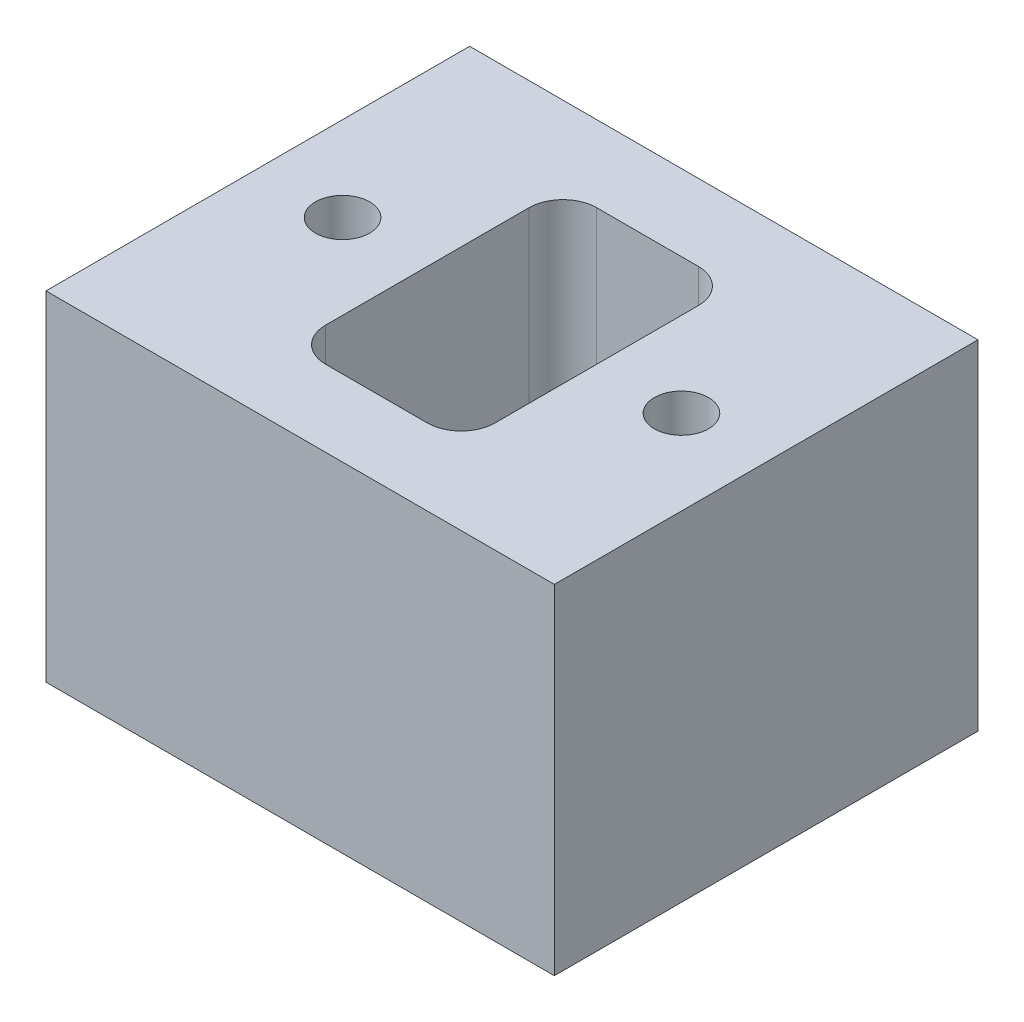
ISO-10303-21;
HEADER;
FILE_DESCRIPTION(('STEP AP214'),'2;1');
FILE_NAME('part.step','',(''),(''),'','','');
FILE_SCHEMA(('AUTOMOTIVE_DESIGN { 1 0 10303 214 1 1 1 1 }'));
ENDSEC;
DATA;
#1=APPLICATION_CONTEXT('core data for automotive mechanical design processes');
#2=APPLICATION_PROTOCOL_DEFINITION('international standard','automotive_design',2000,#1);
#3=PRODUCT_CONTEXT('',#1,'mechanical');
#4=PRODUCT('Part','Part','',(#3));
#5=PRODUCT_RELATED_PRODUCT_CATEGORY('part','',(#4));
#6=PRODUCT_DEFINITION_FORMATION('','',#4);
#7=PRODUCT_DEFINITION_CONTEXT('part definition',#1,'design');
#8=PRODUCT_DEFINITION('design','',#6,#7);
#9=PRODUCT_DEFINITION_SHAPE('','',#8);
#10=(LENGTH_UNIT() NAMED_UNIT(*) SI_UNIT(.MILLI.,.METRE.));
#11=(NAMED_UNIT(*) PLANE_ANGLE_UNIT() SI_UNIT($,.RADIAN.));
#12=(NAMED_UNIT(*) SI_UNIT($,.STERADIAN.) SOLID_ANGLE_UNIT());
#13=UNCERTAINTY_MEASURE_WITH_UNIT(LENGTH_MEASURE(1.E-05),#10,'distance_accuracy_value','');
#14=(GEOMETRIC_REPRESENTATION_CONTEXT(3) GLOBAL_UNCERTAINTY_ASSIGNED_CONTEXT((#13)) GLOBAL_UNIT_ASSIGNED_CONTEXT((#10,
#11,#12)) REPRESENTATION_CONTEXT('',''));
#15=CARTESIAN_POINT('',(0.,0.,0.));
#16=DIRECTION('',(0.,0.,1.));
#17=DIRECTION('',(1.,0.,0.));
#18=AXIS2_PLACEMENT_3D('',#15,#16,#17);
#19=CARTESIAN_POINT('',(0.,20.,0.));
#20=DIRECTION('',(0.,-1.,0.));
#21=DIRECTION('',(0.,0.,-1.));
#22=AXIS2_PLACEMENT_3D('',#19,#20,#21);
#23=PLANE('',#22);
#24=DIRECTION('',(1.,0.,0.));
#25=VECTOR('',#24,1.);
#26=CARTESIAN_POINT('',(-3.,20.,8.));
#27=LINE('',#26,#25);
#28=CARTESIAN_POINT('',(-3.,20.,8.));
#29=VERTEX_POINT('',#28);
#30=CARTESIAN_POINT('',(3.,20.,8.));
#31=VERTEX_POINT('',#30);
#32=EDGE_CURVE('E163',#29,#31,#27,.T.);
#33=ORIENTED_EDGE('',*,*,#32,.F.);
#34=CARTESIAN_POINT('',(-3.,20.,6.));
#35=DIRECTION('',(0.,1.,0.));
#36=DIRECTION('',(0.,0.,-1.));
#37=AXIS2_PLACEMENT_3D('',#34,#35,#36);
#38=CIRCLE('',#37,2.);
#39=CARTESIAN_POINT('',(-5.,20.,6.));
#40=VERTEX_POINT('',#39);
#41=EDGE_CURVE('E50',#40,#29,#38,.T.);
#42=ORIENTED_EDGE('',*,*,#41,.F.);
#43=DIRECTION('',(0.,0.,1.));
#44=VECTOR('',#43,1.);
#45=CARTESIAN_POINT('',(-5.,20.,6.));
#46=LINE('',#45,#44);
#47=CARTESIAN_POINT('',(-5.,20.,-6.));
#48=VERTEX_POINT('',#47);
#49=EDGE_CURVE('E143',#48,#40,#46,.T.);
#50=ORIENTED_EDGE('',*,*,#49,.F.);
#51=CARTESIAN_POINT('',(-3.,20.,-6.));
#52=DIRECTION('',(0.,1.,0.));
#53=DIRECTION('',(0.,0.,-1.));
#54=AXIS2_PLACEMENT_3D('',#51,#52,#53);
#55=CIRCLE('',#54,2.);
#56=CARTESIAN_POINT('',(-3.,20.,-8.));
#57=VERTEX_POINT('',#56);
#58=EDGE_CURVE('E146',#57,#48,#55,.T.);
#59=ORIENTED_EDGE('',*,*,#58,.F.);
#60=DIRECTION('',(-1.,0.,0.));
#61=VECTOR('',#60,1.);
#62=CARTESIAN_POINT('',(-3.,20.,-8.));
#63=LINE('',#62,#61);
#64=CARTESIAN_POINT('',(3.,20.,-8.));
#65=VERTEX_POINT('',#64);
#66=EDGE_CURVE('E174',#65,#57,#63,.T.);
#67=ORIENTED_EDGE('',*,*,#66,.F.);
#68=CARTESIAN_POINT('',(3.,20.,-6.));
#69=DIRECTION('',(0.,1.,0.));
#70=DIRECTION('',(0.,0.,-1.));
#71=AXIS2_PLACEMENT_3D('',#68,#69,#70);
#72=CIRCLE('',#71,2.);
#73=CARTESIAN_POINT('',(5.,20.,-6.));
#74=VERTEX_POINT('',#73);
#75=EDGE_CURVE('E171',#74,#65,#72,.T.);
#76=ORIENTED_EDGE('',*,*,#75,.F.);
#77=DIRECTION('',(0.,0.,-1.));
#78=VECTOR('',#77,1.);
#79=CARTESIAN_POINT('',(5.,20.,6.));
#80=LINE('',#79,#78);
#81=CARTESIAN_POINT('',(5.,20.,6.));
#82=VERTEX_POINT('',#81);
#83=EDGE_CURVE('E168',#82,#74,#80,.T.);
#84=ORIENTED_EDGE('',*,*,#83,.F.);
#85=CARTESIAN_POINT('',(3.,20.,6.));
#86=DIRECTION('',(0.,1.,0.));
#87=DIRECTION('',(0.,0.,1.));
#88=AXIS2_PLACEMENT_3D('',#85,#86,#87);
#89=CIRCLE('',#88,2.);
#90=EDGE_CURVE('E165',#31,#82,#89,.T.);
#91=ORIENTED_EDGE('',*,*,#90,.F.);
#92=EDGE_LOOP('',(#33,#42,#50,#59,#67,#76,#84,#91));
#93=FACE_BOUND('',#92,.T.);
#94=DIRECTION('',(0.,0.,-1.));
#95=VECTOR('',#94,1.);
#96=CARTESIAN_POINT('',(15.,20.,12.5));
#97=LINE('',#96,#95);
#98=CARTESIAN_POINT('',(15.,20.,12.5));
#99=VERTEX_POINT('',#98);
#100=CARTESIAN_POINT('',(15.,20.,-12.5));
#101=VERTEX_POINT('',#100);
#102=EDGE_CURVE('E205',#99,#101,#97,.T.);
#103=ORIENTED_EDGE('',*,*,#102,.T.);
#104=DIRECTION('',(-1.,0.,0.));
#105=VECTOR('',#104,1.);
#106=CARTESIAN_POINT('',(-15.,20.,-12.5));
#107=LINE('',#106,#105);
#108=CARTESIAN_POINT('',(-15.,20.,-12.5));
#109=VERTEX_POINT('',#108);
#110=EDGE_CURVE('E208',#101,#109,#107,.T.);
#111=ORIENTED_EDGE('',*,*,#110,.T.);
#112=DIRECTION('',(0.,0.,1.));
#113=VECTOR('',#112,1.);
#114=CARTESIAN_POINT('',(-15.,20.,12.5));
#115=LINE('',#114,#113);
#116=CARTESIAN_POINT('',(-15.,20.,12.5));
#117=VERTEX_POINT('',#116);
#118=EDGE_CURVE('E211',#109,#117,#115,.T.);
#119=ORIENTED_EDGE('',*,*,#118,.T.);
#120=DIRECTION('',(1.,0.,0.));
#121=VECTOR('',#120,1.);
#122=CARTESIAN_POINT('',(-15.,20.,12.5));
#123=LINE('',#122,#121);
#124=EDGE_CURVE('E213',#117,#99,#123,.T.);
#125=ORIENTED_EDGE('',*,*,#124,.T.);
#126=EDGE_LOOP('',(#103,#111,#119,#125));
#127=FACE_BOUND('',#126,.T.);
#128=CARTESIAN_POINT('',(-10.,20.,0.));
#129=DIRECTION('',(0.,1.,0.));
#130=DIRECTION('',(0.,0.,1.));
#131=AXIS2_PLACEMENT_3D('',#128,#129,#130);
#132=CIRCLE('',#131,1.6);
#133=CARTESIAN_POINT('',(-10.,20.,1.6));
#134=VERTEX_POINT('',#133);
#135=EDGE_CURVE('E199',#134,#134,#132,.T.);
#136=ORIENTED_EDGE('',*,*,#135,.F.);
#137=EDGE_LOOP('',(#136));
#138=FACE_BOUND('',#137,.T.);
#139=CARTESIAN_POINT('',(10.,20.,0.));
#140=DIRECTION('',(0.,1.,0.));
#141=DIRECTION('',(0.,0.,1.));
#142=AXIS2_PLACEMENT_3D('',#139,#140,#141);
#143=CIRCLE('',#142,1.6);
#144=CARTESIAN_POINT('',(10.,20.,1.6));
#145=VERTEX_POINT('',#144);
#146=EDGE_CURVE('E193',#145,#145,#143,.T.);
#147=ORIENTED_EDGE('',*,*,#146,.F.);
#148=EDGE_LOOP('',(#147));
#149=FACE_BOUND('',#148,.T.);
#150=ADVANCED_FACE('F35',(#93,#127,#138,#149),#23,.F.);
#151=CARTESIAN_POINT('',(0.,0.,0.));
#152=DIRECTION('',(0.,-1.,0.));
#153=DIRECTION('',(0.,0.,-1.));
#154=AXIS2_PLACEMENT_3D('',#151,#152,#153);
#155=PLANE('',#154);
#156=CARTESIAN_POINT('',(-3.,0.,6.));
#157=DIRECTION('',(0.,1.,0.));
#158=DIRECTION('',(0.,0.,-1.));
#159=AXIS2_PLACEMENT_3D('',#156,#157,#158);
#160=CIRCLE('',#159,2.);
#161=CARTESIAN_POINT('',(-5.,0.,6.));
#162=VERTEX_POINT('',#161);
#163=CARTESIAN_POINT('',(-3.,0.,8.));
#164=VERTEX_POINT('',#163);
#165=EDGE_CURVE('E126',#162,#164,#160,.T.);
#166=ORIENTED_EDGE('',*,*,#165,.T.);
#167=DIRECTION('',(1.,0.,0.));
#168=VECTOR('',#167,1.);
#169=CARTESIAN_POINT('',(-3.,0.,8.));
#170=LINE('',#169,#168);
#171=CARTESIAN_POINT('',(3.,0.,8.));
#172=VERTEX_POINT('',#171);
#173=EDGE_CURVE('E135',#164,#172,#170,.T.);
#174=ORIENTED_EDGE('',*,*,#173,.T.);
#175=CARTESIAN_POINT('',(3.,0.,6.));
#176=DIRECTION('',(0.,1.,0.));
#177=DIRECTION('',(0.,0.,1.));
#178=AXIS2_PLACEMENT_3D('',#175,#176,#177);
#179=CIRCLE('',#178,2.);
#180=CARTESIAN_POINT('',(5.,0.,6.));
#181=VERTEX_POINT('',#180);
#182=EDGE_CURVE('E58',#172,#181,#179,.T.);
#183=ORIENTED_EDGE('',*,*,#182,.T.);
#184=DIRECTION('',(0.,0.,-1.));
#185=VECTOR('',#184,1.);
#186=CARTESIAN_POINT('',(5.,0.,6.));
#187=LINE('',#186,#185);
#188=CARTESIAN_POINT('',(5.,0.,-6.));
#189=VERTEX_POINT('',#188);
#190=EDGE_CURVE('E150',#181,#189,#187,.T.);
#191=ORIENTED_EDGE('',*,*,#190,.T.);
#192=CARTESIAN_POINT('',(3.,0.,-6.));
#193=DIRECTION('',(0.,1.,0.));
#194=DIRECTION('',(0.,0.,-1.));
#195=AXIS2_PLACEMENT_3D('',#192,#193,#194);
#196=CIRCLE('',#195,2.);
#197=CARTESIAN_POINT('',(3.,0.,-8.));
#198=VERTEX_POINT('',#197);
#199=EDGE_CURVE('E153',#189,#198,#196,.T.);
#200=ORIENTED_EDGE('',*,*,#199,.T.);
#201=DIRECTION('',(-1.,0.,0.));
#202=VECTOR('',#201,1.);
#203=CARTESIAN_POINT('',(-3.,0.,-8.));
#204=LINE('',#203,#202);
#205=CARTESIAN_POINT('',(-3.,0.,-8.));
#206=VERTEX_POINT('',#205);
#207=EDGE_CURVE('E156',#198,#206,#204,.T.);
#208=ORIENTED_EDGE('',*,*,#207,.T.);
#209=CARTESIAN_POINT('',(-3.,0.,-6.));
#210=DIRECTION('',(0.,1.,0.));
#211=DIRECTION('',(0.,0.,-1.));
#212=AXIS2_PLACEMENT_3D('',#209,#210,#211);
#213=CIRCLE('',#212,2.);
#214=CARTESIAN_POINT('',(-5.,0.,-6.));
#215=VERTEX_POINT('',#214);
#216=EDGE_CURVE('E159',#206,#215,#213,.T.);
#217=ORIENTED_EDGE('',*,*,#216,.T.);
#218=DIRECTION('',(0.,0.,1.));
#219=VECTOR('',#218,1.);
#220=CARTESIAN_POINT('',(-5.,0.,6.));
#221=LINE('',#220,#219);
#222=EDGE_CURVE('E132',#215,#162,#221,.T.);
#223=ORIENTED_EDGE('',*,*,#222,.T.);
#224=EDGE_LOOP('',(#166,#174,#183,#191,#200,#208,#217,#223));
#225=FACE_BOUND('',#224,.T.);
#226=CARTESIAN_POINT('',(-10.,0.,0.));
#227=DIRECTION('',(0.,1.,0.));
#228=DIRECTION('',(0.,0.,1.));
#229=AXIS2_PLACEMENT_3D('',#226,#227,#228);
#230=CIRCLE('',#229,1.6);
#231=CARTESIAN_POINT('',(-10.,0.,1.6));
#232=VERTEX_POINT('',#231);
#233=EDGE_CURVE('E196',#232,#232,#230,.T.);
#234=ORIENTED_EDGE('',*,*,#233,.T.);
#235=EDGE_LOOP('',(#234));
#236=FACE_BOUND('',#235,.T.);
#237=DIRECTION('',(0.,0.,-1.));
#238=VECTOR('',#237,1.);
#239=CARTESIAN_POINT('',(15.,0.,12.5));
#240=LINE('',#239,#238);
#241=CARTESIAN_POINT('',(15.,0.,12.5));
#242=VERTEX_POINT('',#241);
#243=CARTESIAN_POINT('',(15.,0.,-12.5));
#244=VERTEX_POINT('',#243);
#245=EDGE_CURVE('E202',#242,#244,#240,.T.);
#246=ORIENTED_EDGE('',*,*,#245,.F.);
#247=DIRECTION('',(1.,0.,0.));
#248=VECTOR('',#247,1.);
#249=CARTESIAN_POINT('',(-15.,0.,12.5));
#250=LINE('',#249,#248);
#251=CARTESIAN_POINT('',(-15.,0.,12.5));
#252=VERTEX_POINT('',#251);
#253=EDGE_CURVE('E209',#252,#242,#250,.T.);
#254=ORIENTED_EDGE('',*,*,#253,.F.);
#255=DIRECTION('',(0.,0.,1.));
#256=VECTOR('',#255,1.);
#257=CARTESIAN_POINT('',(-15.,0.,12.5));
#258=LINE('',#257,#256);
#259=CARTESIAN_POINT('',(-15.,0.,-12.5));
#260=VERTEX_POINT('',#259);
#261=EDGE_CURVE('E220',#260,#252,#258,.T.);
#262=ORIENTED_EDGE('',*,*,#261,.F.);
#263=DIRECTION('',(-1.,0.,0.));
#264=VECTOR('',#263,1.);
#265=CARTESIAN_POINT('',(-15.,0.,-12.5));
#266=LINE('',#265,#264);
#267=EDGE_CURVE('E218',#244,#260,#266,.T.);
#268=ORIENTED_EDGE('',*,*,#267,.F.);
#269=EDGE_LOOP('',(#246,#254,#262,#268));
#270=FACE_BOUND('',#269,.T.);
#271=CARTESIAN_POINT('',(10.,0.,0.));
#272=DIRECTION('',(0.,1.,0.));
#273=DIRECTION('',(0.,0.,1.));
#274=AXIS2_PLACEMENT_3D('',#271,#272,#273);
#275=CIRCLE('',#274,1.6);
#276=CARTESIAN_POINT('',(10.,0.,1.6));
#277=VERTEX_POINT('',#276);
#278=EDGE_CURVE('E181',#277,#277,#275,.T.);
#279=ORIENTED_EDGE('',*,*,#278,.T.);
#280=EDGE_LOOP('',(#279));
#281=FACE_BOUND('',#280,.T.);
#282=ADVANCED_FACE('F139',(#225,#236,#270,#281),#155,.T.);
#283=CARTESIAN_POINT('',(15.,20.,12.5));
#284=DIRECTION('',(-1.,0.,0.));
#285=DIRECTION('',(0.,0.,1.));
#286=AXIS2_PLACEMENT_3D('',#283,#284,#285);
#287=PLANE('',#286);
#288=ORIENTED_EDGE('',*,*,#245,.T.);
#289=DIRECTION('',(0.,-1.,0.));
#290=VECTOR('',#289,1.);
#291=CARTESIAN_POINT('',(15.,20.,-12.5));
#292=LINE('',#291,#290);
#293=EDGE_CURVE('E11',#101,#244,#292,.T.);
#294=ORIENTED_EDGE('',*,*,#293,.F.);
#295=ORIENTED_EDGE('',*,*,#102,.F.);
#296=DIRECTION('',(0.,-1.,0.));
#297=VECTOR('',#296,1.);
#298=CARTESIAN_POINT('',(15.,20.,12.5));
#299=LINE('',#298,#297);
#300=EDGE_CURVE('E215',#99,#242,#299,.T.);
#301=ORIENTED_EDGE('',*,*,#300,.T.);
#302=EDGE_LOOP('',(#288,#294,#295,#301));
#303=FACE_BOUND('',#302,.T.);
#304=ADVANCED_FACE('F37',(#303),#287,.F.);
#305=CARTESIAN_POINT('',(-15.,20.,-12.5));
#306=DIRECTION('',(0.,0.,1.));
#307=DIRECTION('',(1.,0.,0.));
#308=AXIS2_PLACEMENT_3D('',#305,#306,#307);
#309=PLANE('',#308);
#310=ORIENTED_EDGE('',*,*,#267,.T.);
#311=DIRECTION('',(0.,-1.,0.));
#312=VECTOR('',#311,1.);
#313=CARTESIAN_POINT('',(-15.,20.,-12.5));
#314=LINE('',#313,#312);
#315=EDGE_CURVE('E43',#109,#260,#314,.T.);
#316=ORIENTED_EDGE('',*,*,#315,.F.);
#317=ORIENTED_EDGE('',*,*,#110,.F.);
#318=ORIENTED_EDGE('',*,*,#293,.T.);
#319=EDGE_LOOP('',(#310,#316,#317,#318));
#320=FACE_BOUND('',#319,.T.);
#321=ADVANCED_FACE('F248',(#320),#309,.F.);
#322=CARTESIAN_POINT('',(-15.,20.,12.5));
#323=DIRECTION('',(1.,0.,0.));
#324=DIRECTION('',(0.,0.,-1.));
#325=AXIS2_PLACEMENT_3D('',#322,#323,#324);
#326=PLANE('',#325);
#327=ORIENTED_EDGE('',*,*,#261,.T.);
#328=DIRECTION('',(0.,-1.,0.));
#329=VECTOR('',#328,1.);
#330=CARTESIAN_POINT('',(-15.,20.,12.5));
#331=LINE('',#330,#329);
#332=EDGE_CURVE('E225',#117,#252,#331,.T.);
#333=ORIENTED_EDGE('',*,*,#332,.F.);
#334=ORIENTED_EDGE('',*,*,#118,.F.);
#335=ORIENTED_EDGE('',*,*,#315,.T.);
#336=EDGE_LOOP('',(#327,#333,#334,#335));
#337=FACE_BOUND('',#336,.T.);
#338=ADVANCED_FACE('F232',(#337),#326,.F.);
#339=CARTESIAN_POINT('',(-15.,20.,12.5));
#340=DIRECTION('',(0.,0.,-1.));
#341=DIRECTION('',(-1.,0.,0.));
#342=AXIS2_PLACEMENT_3D('',#339,#340,#341);
#343=PLANE('',#342);
#344=ORIENTED_EDGE('',*,*,#253,.T.);
#345=ORIENTED_EDGE('',*,*,#300,.F.);
#346=ORIENTED_EDGE('',*,*,#124,.F.);
#347=ORIENTED_EDGE('',*,*,#332,.T.);
#348=EDGE_LOOP('',(#344,#345,#346,#347));
#349=FACE_BOUND('',#348,.T.);
#350=ADVANCED_FACE('F241',(#349),#343,.F.);
#351=CARTESIAN_POINT('',(-10.,20.,0.));
#352=DIRECTION('',(0.,-1.,0.));
#353=DIRECTION('',(0.,0.,-1.));
#354=AXIS2_PLACEMENT_3D('',#351,#352,#353);
#355=CYLINDRICAL_SURFACE('',#354,1.6);
#356=ORIENTED_EDGE('',*,*,#135,.T.);
#357=EDGE_LOOP('',(#356));
#358=FACE_BOUND('',#357,.T.);
#359=ORIENTED_EDGE('',*,*,#233,.F.);
#360=EDGE_LOOP('',(#359));
#361=FACE_BOUND('',#360,.T.);
#362=ADVANCED_FACE('F263',(#358,#361),#355,.F.);
#363=CARTESIAN_POINT('',(10.,20.,0.));
#364=DIRECTION('',(0.,-1.,0.));
#365=DIRECTION('',(0.,0.,-1.));
#366=AXIS2_PLACEMENT_3D('',#363,#364,#365);
#367=CYLINDRICAL_SURFACE('',#366,1.6);
#368=ORIENTED_EDGE('',*,*,#146,.T.);
#369=EDGE_LOOP('',(#368));
#370=FACE_BOUND('',#369,.T.);
#371=ORIENTED_EDGE('',*,*,#278,.F.);
#372=EDGE_LOOP('',(#371));
#373=FACE_BOUND('',#372,.T.);
#374=ADVANCED_FACE('F270',(#370,#373),#367,.F.);
#375=CARTESIAN_POINT('',(-3.,0.,6.));
#376=DIRECTION('',(0.,1.,0.));
#377=DIRECTION('',(0.,0.,1.));
#378=AXIS2_PLACEMENT_3D('',#375,#376,#377);
#379=CYLINDRICAL_SURFACE('',#378,2.);
#380=ORIENTED_EDGE('',*,*,#41,.T.);
#381=DIRECTION('',(0.,1.,0.));
#382=VECTOR('',#381,1.);
#383=CARTESIAN_POINT('',(-3.,0.,8.));
#384=LINE('',#383,#382);
#385=EDGE_CURVE('E122',#164,#29,#384,.T.);
#386=ORIENTED_EDGE('',*,*,#385,.F.);
#387=ORIENTED_EDGE('',*,*,#165,.F.);
#388=DIRECTION('',(0.,1.,0.));
#389=VECTOR('',#388,1.);
#390=CARTESIAN_POINT('',(-5.,0.,6.));
#391=LINE('',#390,#389);
#392=EDGE_CURVE('E179',#162,#40,#391,.T.);
#393=ORIENTED_EDGE('',*,*,#392,.T.);
#394=EDGE_LOOP('',(#380,#386,#387,#393));
#395=FACE_BOUND('',#394,.T.);
#396=ADVANCED_FACE('F124',(#395),#379,.F.);
#397=CARTESIAN_POINT('',(-5.,0.,6.));
#398=DIRECTION('',(-1.,0.,0.));
#399=DIRECTION('',(0.,0.,1.));
#400=AXIS2_PLACEMENT_3D('',#397,#398,#399);
#401=PLANE('',#400);
#402=ORIENTED_EDGE('',*,*,#49,.T.);
#403=ORIENTED_EDGE('',*,*,#392,.F.);
#404=ORIENTED_EDGE('',*,*,#222,.F.);
#405=DIRECTION('',(0.,1.,0.));
#406=VECTOR('',#405,1.);
#407=CARTESIAN_POINT('',(-5.,0.,-6.));
#408=LINE('',#407,#406);
#409=EDGE_CURVE('E182',#215,#48,#408,.T.);
#410=ORIENTED_EDGE('',*,*,#409,.T.);
#411=EDGE_LOOP('',(#402,#403,#404,#410));
#412=FACE_BOUND('',#411,.T.);
#413=ADVANCED_FACE('F286',(#412),#401,.F.);
#414=CARTESIAN_POINT('',(-3.,0.,-6.));
#415=DIRECTION('',(0.,1.,0.));
#416=DIRECTION('',(0.,0.,1.));
#417=AXIS2_PLACEMENT_3D('',#414,#415,#416);
#418=CYLINDRICAL_SURFACE('',#417,2.);
#419=ORIENTED_EDGE('',*,*,#58,.T.);
#420=ORIENTED_EDGE('',*,*,#409,.F.);
#421=ORIENTED_EDGE('',*,*,#216,.F.);
#422=DIRECTION('',(0.,1.,0.));
#423=VECTOR('',#422,1.);
#424=CARTESIAN_POINT('',(-3.,0.,-8.));
#425=LINE('',#424,#423);
#426=EDGE_CURVE('E184',#206,#57,#425,.T.);
#427=ORIENTED_EDGE('',*,*,#426,.T.);
#428=EDGE_LOOP('',(#419,#420,#421,#427));
#429=FACE_BOUND('',#428,.T.);
#430=ADVANCED_FACE('F305',(#429),#418,.F.);
#431=CARTESIAN_POINT('',(-3.,0.,-8.));
#432=DIRECTION('',(0.,0.,-1.));
#433=DIRECTION('',(-1.,0.,0.));
#434=AXIS2_PLACEMENT_3D('',#431,#432,#433);
#435=PLANE('',#434);
#436=ORIENTED_EDGE('',*,*,#66,.T.);
#437=ORIENTED_EDGE('',*,*,#426,.F.);
#438=ORIENTED_EDGE('',*,*,#207,.F.);
#439=DIRECTION('',(0.,1.,0.));
#440=VECTOR('',#439,1.);
#441=CARTESIAN_POINT('',(3.,0.,-8.));
#442=LINE('',#441,#440);
#443=EDGE_CURVE('E186',#198,#65,#442,.T.);
#444=ORIENTED_EDGE('',*,*,#443,.T.);
#445=EDGE_LOOP('',(#436,#437,#438,#444));
#446=FACE_BOUND('',#445,.T.);
#447=ADVANCED_FACE('F301',(#446),#435,.F.);
#448=CARTESIAN_POINT('',(3.,0.,-6.));
#449=DIRECTION('',(0.,1.,0.));
#450=DIRECTION('',(0.,0.,1.));
#451=AXIS2_PLACEMENT_3D('',#448,#449,#450);
#452=CYLINDRICAL_SURFACE('',#451,2.);
#453=ORIENTED_EDGE('',*,*,#75,.T.);
#454=ORIENTED_EDGE('',*,*,#443,.F.);
#455=ORIENTED_EDGE('',*,*,#199,.F.);
#456=DIRECTION('',(0.,1.,0.));
#457=VECTOR('',#456,1.);
#458=CARTESIAN_POINT('',(5.,0.,-6.));
#459=LINE('',#458,#457);
#460=EDGE_CURVE('E188',#189,#74,#459,.T.);
#461=ORIENTED_EDGE('',*,*,#460,.T.);
#462=EDGE_LOOP('',(#453,#454,#455,#461));
#463=FACE_BOUND('',#462,.T.);
#464=ADVANCED_FACE('F297',(#463),#452,.F.);
#465=CARTESIAN_POINT('',(5.,0.,6.));
#466=DIRECTION('',(1.,0.,0.));
#467=DIRECTION('',(0.,0.,-1.));
#468=AXIS2_PLACEMENT_3D('',#465,#466,#467);
#469=PLANE('',#468);
#470=ORIENTED_EDGE('',*,*,#83,.T.);
#471=ORIENTED_EDGE('',*,*,#460,.F.);
#472=ORIENTED_EDGE('',*,*,#190,.F.);
#473=DIRECTION('',(0.,1.,0.));
#474=VECTOR('',#473,1.);
#475=CARTESIAN_POINT('',(5.,0.,6.));
#476=LINE('',#475,#474);
#477=EDGE_CURVE('E190',#181,#82,#476,.T.);
#478=ORIENTED_EDGE('',*,*,#477,.T.);
#479=EDGE_LOOP('',(#470,#471,#472,#478));
#480=FACE_BOUND('',#479,.T.);
#481=ADVANCED_FACE('F294',(#480),#469,.F.);
#482=CARTESIAN_POINT('',(3.,0.,6.));
#483=DIRECTION('',(0.,1.,0.));
#484=DIRECTION('',(0.,0.,1.));
#485=AXIS2_PLACEMENT_3D('',#482,#483,#484);
#486=CYLINDRICAL_SURFACE('',#485,2.);
#487=ORIENTED_EDGE('',*,*,#90,.T.);
#488=ORIENTED_EDGE('',*,*,#477,.F.);
#489=ORIENTED_EDGE('',*,*,#182,.F.);
#490=DIRECTION('',(0.,1.,0.));
#491=VECTOR('',#490,1.);
#492=CARTESIAN_POINT('',(3.,0.,8.));
#493=LINE('',#492,#491);
#494=EDGE_CURVE('E131',#172,#31,#493,.T.);
#495=ORIENTED_EDGE('',*,*,#494,.T.);
#496=EDGE_LOOP('',(#487,#488,#489,#495));
#497=FACE_BOUND('',#496,.T.);
#498=ADVANCED_FACE('F291',(#497),#486,.F.);
#499=CARTESIAN_POINT('',(-3.,0.,8.));
#500=DIRECTION('',(0.,0.,1.));
#501=DIRECTION('',(1.,0.,0.));
#502=AXIS2_PLACEMENT_3D('',#499,#500,#501);
#503=PLANE('',#502);
#504=ORIENTED_EDGE('',*,*,#32,.T.);
#505=ORIENTED_EDGE('',*,*,#494,.F.);
#506=ORIENTED_EDGE('',*,*,#173,.F.);
#507=ORIENTED_EDGE('',*,*,#385,.T.);
#508=EDGE_LOOP('',(#504,#505,#506,#507));
#509=FACE_BOUND('',#508,.T.);
#510=ADVANCED_FACE('F136',(#509),#503,.F.);
#511=CLOSED_SHELL('',(#150,#282,#304,#321,#338,#350,#362,#374,#396,#413,#430,#447,#464,#481,
#498,#510));
#512=MANIFOLD_SOLID_BREP('B2',#511);
#513=ADVANCED_BREP_SHAPE_REPRESENTATION('',(#18,#512),#14);
#514=SHAPE_DEFINITION_REPRESENTATION(#9,#513);
ENDSEC;
END-ISO-10303-21;
